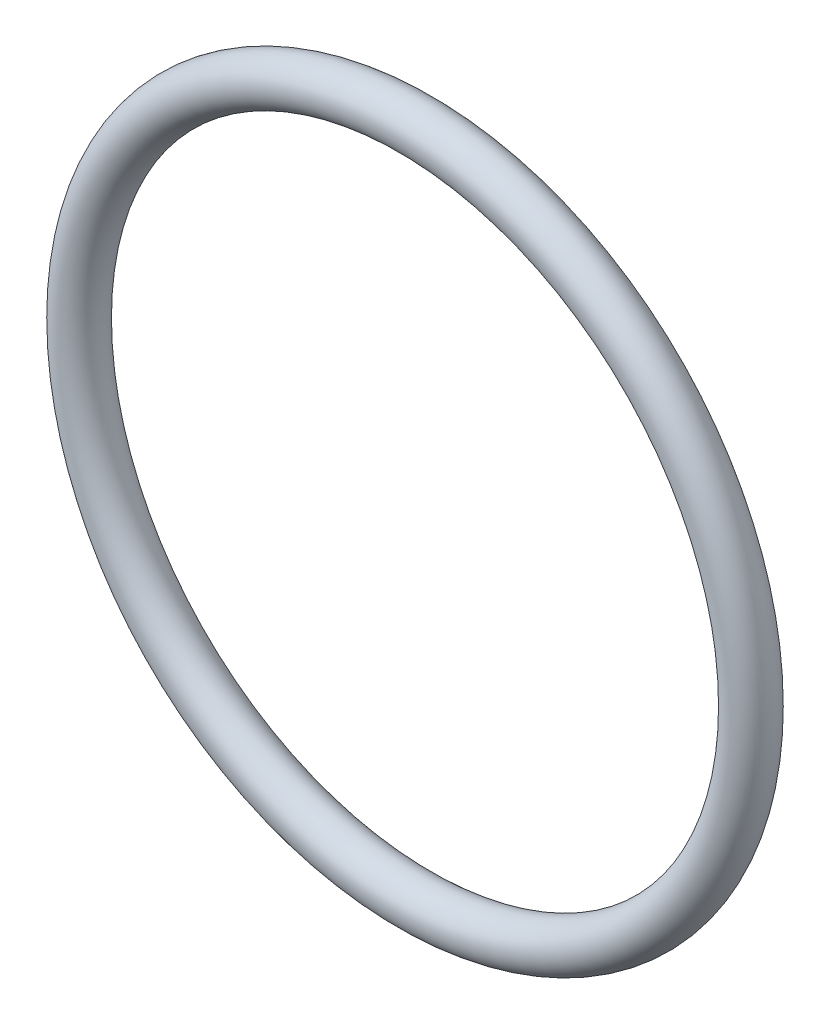
ISO-10303-21;
HEADER;
FILE_DESCRIPTION(('STEP AP214'),'2;1');
FILE_NAME('part.step','',(''),(''),'','','');
FILE_SCHEMA(('AUTOMOTIVE_DESIGN { 1 0 10303 214 1 1 1 1 }'));
ENDSEC;
DATA;
#1=APPLICATION_CONTEXT('core data for automotive mechanical design processes');
#2=APPLICATION_PROTOCOL_DEFINITION('international standard','automotive_design',2000,#1);
#3=PRODUCT_CONTEXT('',#1,'mechanical');
#4=PRODUCT('Part','Part','',(#3));
#5=PRODUCT_RELATED_PRODUCT_CATEGORY('part','',(#4));
#6=PRODUCT_DEFINITION_FORMATION('','',#4);
#7=PRODUCT_DEFINITION_CONTEXT('part definition',#1,'design');
#8=PRODUCT_DEFINITION('design','',#6,#7);
#9=PRODUCT_DEFINITION_SHAPE('','',#8);
#10=(LENGTH_UNIT() NAMED_UNIT(*) SI_UNIT(.MILLI.,.METRE.));
#11=(NAMED_UNIT(*) PLANE_ANGLE_UNIT() SI_UNIT($,.RADIAN.));
#12=(NAMED_UNIT(*) SI_UNIT($,.STERADIAN.) SOLID_ANGLE_UNIT());
#13=UNCERTAINTY_MEASURE_WITH_UNIT(LENGTH_MEASURE(1.E-05),#10,'distance_accuracy_value','');
#14=(GEOMETRIC_REPRESENTATION_CONTEXT(3) GLOBAL_UNCERTAINTY_ASSIGNED_CONTEXT((#13)) GLOBAL_UNIT_ASSIGNED_CONTEXT((#10,
#11,#12)) REPRESENTATION_CONTEXT('',''));
#15=CARTESIAN_POINT('',(0.,0.,0.));
#16=DIRECTION('',(0.,0.,1.));
#17=DIRECTION('',(1.,0.,0.));
#18=AXIS2_PLACEMENT_3D('',#15,#16,#17);
#19=CARTESIAN_POINT('',(0.,0.,0.));
#20=DIRECTION('',(0.,0.,-1.));
#21=DIRECTION('',(-1.,0.,0.));
#22=AXIS2_PLACEMENT_3D('',#19,#20,#21);
#23=TOROIDAL_SURFACE('',#22,22.,1.5);
#24=CARTESIAN_POINT('',(-23.5,0.,0.));
#25=VERTEX_POINT('',#24);
#26=VERTEX_LOOP('',#25);
#27=FACE_BOUND('',#26,.T.);
#28=ADVANCED_FACE('F33',(#27),#23,.T.);
#29=CLOSED_SHELL('',(#28));
#30=MANIFOLD_SOLID_BREP('B2',#29);
#31=ADVANCED_BREP_SHAPE_REPRESENTATION('',(#18,#30),#14);
#32=SHAPE_DEFINITION_REPRESENTATION(#9,#31);
ENDSEC;
END-ISO-10303-21;
